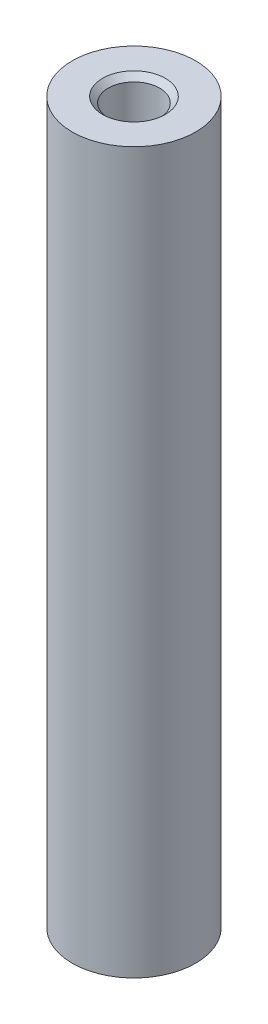
ISO-10303-21;
HEADER;
FILE_DESCRIPTION(('STEP AP214'),'2;1');
FILE_NAME('part.step','',(''),(''),'','','');
FILE_SCHEMA(('AUTOMOTIVE_DESIGN { 1 0 10303 214 1 1 1 1 }'));
ENDSEC;
DATA;
#1=APPLICATION_CONTEXT('core data for automotive mechanical design processes');
#2=APPLICATION_PROTOCOL_DEFINITION('international standard','automotive_design',2000,#1);
#3=PRODUCT_CONTEXT('',#1,'mechanical');
#4=PRODUCT('Part','Part','',(#3));
#5=PRODUCT_RELATED_PRODUCT_CATEGORY('part','',(#4));
#6=PRODUCT_DEFINITION_FORMATION('','',#4);
#7=PRODUCT_DEFINITION_CONTEXT('part definition',#1,'design');
#8=PRODUCT_DEFINITION('design','',#6,#7);
#9=PRODUCT_DEFINITION_SHAPE('','',#8);
#10=(LENGTH_UNIT() NAMED_UNIT(*) SI_UNIT(.MILLI.,.METRE.));
#11=(NAMED_UNIT(*) PLANE_ANGLE_UNIT() SI_UNIT($,.RADIAN.));
#12=(NAMED_UNIT(*) SI_UNIT($,.STERADIAN.) SOLID_ANGLE_UNIT());
#13=UNCERTAINTY_MEASURE_WITH_UNIT(LENGTH_MEASURE(1.E-05),#10,'distance_accuracy_value','');
#14=(GEOMETRIC_REPRESENTATION_CONTEXT(3) GLOBAL_UNCERTAINTY_ASSIGNED_CONTEXT((#13)) GLOBAL_UNIT_ASSIGNED_CONTEXT((#10,
#11,#12)) REPRESENTATION_CONTEXT('',''));
#15=CARTESIAN_POINT('',(0.,0.,0.));
#16=DIRECTION('',(0.,0.,1.));
#17=DIRECTION('',(1.,0.,0.));
#18=AXIS2_PLACEMENT_3D('',#15,#16,#17);
#19=CARTESIAN_POINT('',(0.,35.,0.));
#20=DIRECTION('',(0.,-1.,0.));
#21=DIRECTION('',(0.,0.,-1.));
#22=AXIS2_PLACEMENT_3D('',#19,#20,#21);
#23=CYLINDRICAL_SURFACE('',#22,3.);
#24=CARTESIAN_POINT('',(0.,35.,0.));
#25=DIRECTION('',(0.,1.,0.));
#26=DIRECTION('',(0.,0.,1.));
#27=AXIS2_PLACEMENT_3D('',#24,#25,#26);
#28=CIRCLE('',#27,3.);
#29=CARTESIAN_POINT('',(0.,35.,3.));
#30=VERTEX_POINT('',#29);
#31=EDGE_CURVE('E10',#30,#30,#28,.T.);
#32=ORIENTED_EDGE('',*,*,#31,.F.);
#33=EDGE_LOOP('',(#32));
#34=FACE_BOUND('',#33,.T.);
#35=CARTESIAN_POINT('',(0.,0.,0.));
#36=DIRECTION('',(0.,1.,0.));
#37=DIRECTION('',(0.,0.,1.));
#38=AXIS2_PLACEMENT_3D('',#35,#36,#37);
#39=CIRCLE('',#38,3.);
#40=CARTESIAN_POINT('',(0.,0.,3.));
#41=VERTEX_POINT('',#40);
#42=EDGE_CURVE('E38',#41,#41,#39,.T.);
#43=ORIENTED_EDGE('',*,*,#42,.T.);
#44=EDGE_LOOP('',(#43));
#45=FACE_BOUND('',#44,.T.);
#46=ADVANCED_FACE('F35',(#34,#45),#23,.T.);
#47=CARTESIAN_POINT('',(0.,35.,0.));
#48=DIRECTION('',(0.,1.,0.));
#49=DIRECTION('',(0.,0.,1.));
#50=AXIS2_PLACEMENT_3D('',#47,#48,#49);
#51=PLANE('',#50);
#52=CARTESIAN_POINT('',(0.,35.,0.));
#53=DIRECTION('',(0.,1.,0.));
#54=DIRECTION('',(0.,0.,1.));
#55=AXIS2_PLACEMENT_3D('',#52,#53,#54);
#56=CIRCLE('',#55,1.525);
#57=CARTESIAN_POINT('',(0.,35.,1.525));
#58=VERTEX_POINT('',#57);
#59=EDGE_CURVE('E52',#58,#58,#56,.T.);
#60=ORIENTED_EDGE('',*,*,#59,.F.);
#61=EDGE_LOOP('',(#60));
#62=FACE_BOUND('',#61,.T.);
#63=ORIENTED_EDGE('',*,*,#31,.T.);
#64=EDGE_LOOP('',(#63));
#65=FACE_BOUND('',#64,.T.);
#66=ADVANCED_FACE('F58',(#62,#65),#51,.T.);
#67=CARTESIAN_POINT('',(0.,0.,0.));
#68=DIRECTION('',(0.,1.,0.));
#69=DIRECTION('',(0.,0.,1.));
#70=AXIS2_PLACEMENT_3D('',#67,#68,#69);
#71=PLANE('',#70);
#72=CARTESIAN_POINT('',(0.,0.,0.));
#73=DIRECTION('',(0.,1.,0.));
#74=DIRECTION('',(0.,0.,1.));
#75=AXIS2_PLACEMENT_3D('',#72,#73,#74);
#76=CIRCLE('',#75,1.24999999999999);
#77=CARTESIAN_POINT('',(0.,0.,1.24999999999999));
#78=VERTEX_POINT('',#77);
#79=EDGE_CURVE('E45',#78,#78,#76,.T.);
#80=ORIENTED_EDGE('',*,*,#79,.T.);
#81=EDGE_LOOP('',(#80));
#82=FACE_BOUND('',#81,.T.);
#83=ORIENTED_EDGE('',*,*,#42,.F.);
#84=EDGE_LOOP('',(#83));
#85=FACE_BOUND('',#84,.T.);
#86=ADVANCED_FACE('F60',(#82,#85),#71,.F.);
#87=CARTESIAN_POINT('',(0.,35.,0.));
#88=DIRECTION('',(0.,1.,0.));
#89=DIRECTION('',(0.,0.,1.));
#90=AXIS2_PLACEMENT_3D('',#87,#88,#89);
#91=CYLINDRICAL_SURFACE('',#90,1.24999999999999);
#92=ORIENTED_EDGE('',*,*,#79,.F.);
#93=EDGE_LOOP('',(#92));
#94=FACE_BOUND('',#93,.T.);
#95=CARTESIAN_POINT('',(0.,34.725,0.));
#96=DIRECTION('',(0.,1.,0.));
#97=DIRECTION('',(0.,0.,1.));
#98=AXIS2_PLACEMENT_3D('',#95,#96,#97);
#99=CIRCLE('',#98,1.25);
#100=CARTESIAN_POINT('',(0.,34.725,1.25));
#101=VERTEX_POINT('',#100);
#102=EDGE_CURVE('E49',#101,#101,#99,.T.);
#103=ORIENTED_EDGE('',*,*,#102,.T.);
#104=EDGE_LOOP('',(#103));
#105=FACE_BOUND('',#104,.T.);
#106=ADVANCED_FACE('F66',(#94,#105),#91,.F.);
#107=CARTESIAN_POINT('',(0.,35.,0.));
#108=DIRECTION('',(0.,1.,0.));
#109=DIRECTION('',(0.,0.,1.));
#110=AXIS2_PLACEMENT_3D('',#107,#108,#109);
#111=CONICAL_SURFACE('',#110,1.525,0.785398163397442);
#112=ORIENTED_EDGE('',*,*,#102,.F.);
#113=EDGE_LOOP('',(#112));
#114=FACE_BOUND('',#113,.T.);
#115=ORIENTED_EDGE('',*,*,#59,.T.);
#116=EDGE_LOOP('',(#115));
#117=FACE_BOUND('',#116,.T.);
#118=ADVANCED_FACE('F56',(#114,#117),#111,.F.);
#119=CLOSED_SHELL('',(#46,#66,#86,#106,#118));
#120=MANIFOLD_SOLID_BREP('B2',#119);
#121=ADVANCED_BREP_SHAPE_REPRESENTATION('',(#18,#120),#14);
#122=SHAPE_DEFINITION_REPRESENTATION(#9,#121);
ENDSEC;
END-ISO-10303-21;
